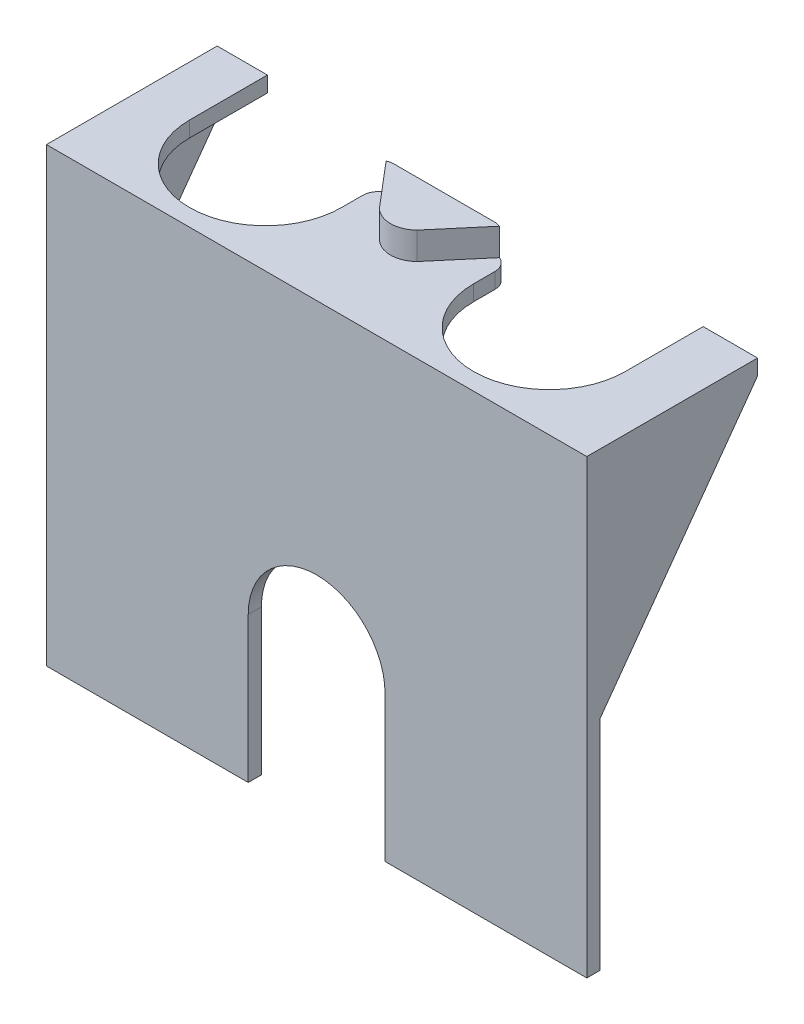
ISO-10303-21;
HEADER;
FILE_DESCRIPTION(('STEP AP214'),'2;1');
FILE_NAME('part.step','',(''),(''),'','','');
FILE_SCHEMA(('AUTOMOTIVE_DESIGN { 1 0 10303 214 1 1 1 1 }'));
ENDSEC;
DATA;
#1=APPLICATION_CONTEXT('core data for automotive mechanical design processes');
#2=APPLICATION_PROTOCOL_DEFINITION('international standard','automotive_design',2000,#1);
#3=PRODUCT_CONTEXT('',#1,'mechanical');
#4=PRODUCT('Part','Part','',(#3));
#5=PRODUCT_RELATED_PRODUCT_CATEGORY('part','',(#4));
#6=PRODUCT_DEFINITION_FORMATION('','',#4);
#7=PRODUCT_DEFINITION_CONTEXT('part definition',#1,'design');
#8=PRODUCT_DEFINITION('design','',#6,#7);
#9=PRODUCT_DEFINITION_SHAPE('','',#8);
#10=(LENGTH_UNIT() NAMED_UNIT(*) SI_UNIT(.MILLI.,.METRE.));
#11=(NAMED_UNIT(*) PLANE_ANGLE_UNIT() SI_UNIT($,.RADIAN.));
#12=(NAMED_UNIT(*) SI_UNIT($,.STERADIAN.) SOLID_ANGLE_UNIT());
#13=UNCERTAINTY_MEASURE_WITH_UNIT(LENGTH_MEASURE(1.E-05),#10,'distance_accuracy_value','');
#14=(GEOMETRIC_REPRESENTATION_CONTEXT(3) GLOBAL_UNCERTAINTY_ASSIGNED_CONTEXT((#13)) GLOBAL_UNIT_ASSIGNED_CONTEXT((#10,
#11,#12)) REPRESENTATION_CONTEXT('',''));
#15=CARTESIAN_POINT('',(0.,0.,0.));
#16=DIRECTION('',(0.,0.,1.));
#17=DIRECTION('',(1.,0.,0.));
#18=AXIS2_PLACEMENT_3D('',#15,#16,#17);
#19=CARTESIAN_POINT('',(0.,0.,0.));
#20=DIRECTION('',(0.,-1.,0.));
#21=DIRECTION('',(0.,0.,-1.));
#22=AXIS2_PLACEMENT_3D('',#19,#20,#21);
#23=PLANE('',#22);
#24=DIRECTION('',(1.,0.,0.));
#25=VECTOR('',#24,1.);
#26=CARTESIAN_POINT('',(0.,0.,-5.70068802749037));
#27=LINE('',#26,#25);
#28=CARTESIAN_POINT('',(72.,0.,-5.70068802749037));
#29=VERTEX_POINT('',#28);
#30=CARTESIAN_POINT('',(133.81659653948,0.,-5.70068802749037));
#31=VERTEX_POINT('',#30);
#32=EDGE_CURVE('E309',#29,#31,#27,.T.);
#33=ORIENTED_EDGE('',*,*,#32,.F.);
#34=DIRECTION('',(0.,0.,1.));
#35=VECTOR('',#34,1.);
#36=CARTESIAN_POINT('',(72.,0.,-5.70068802749037));
#37=LINE('',#36,#35);
#38=CARTESIAN_POINT('',(72.,0.,-35.6499148873949));
#39=VERTEX_POINT('',#38);
#40=EDGE_CURVE('E56',#39,#29,#37,.T.);
#41=ORIENTED_EDGE('',*,*,#40,.F.);
#42=DIRECTION('',(-1.,0.,0.));
#43=VECTOR('',#42,1.);
#44=CARTESIAN_POINT('',(0.,0.,-35.6499148873949));
#45=LINE('',#44,#43);
#46=CARTESIAN_POINT('',(81.8377847097465,0.,-35.6499148873949));
#47=VERTEX_POINT('',#46);
#48=EDGE_CURVE('E338',#47,#39,#45,.T.);
#49=ORIENTED_EDGE('',*,*,#48,.F.);
#50=CARTESIAN_POINT('',(81.8377847097465,0.,-31.6499148873949));
#51=DIRECTION('',(0.,-1.,0.));
#52=DIRECTION('',(0.,0.,-1.));
#53=AXIS2_PLACEMENT_3D('',#50,#51,#52);
#54=CIRCLE('',#53,4.);
#55=CARTESIAN_POINT('',(85.8377847097465,0.,-31.6499148873949));
#56=VERTEX_POINT('',#55);
#57=EDGE_CURVE('E449',#47,#56,#54,.T.);
#58=ORIENTED_EDGE('',*,*,#57,.T.);
#59=DIRECTION('',(0.,0.,1.));
#60=VECTOR('',#59,1.);
#61=CARTESIAN_POINT('',(85.8377847097465,0.,-26.185261769423));
#62=LINE('',#61,#60);
#63=CARTESIAN_POINT('',(85.8377847097465,0.,-26.185261769423));
#64=VERTEX_POINT('',#63);
#65=EDGE_CURVE('E384',#56,#64,#62,.T.);
#66=ORIENTED_EDGE('',*,*,#65,.T.);
#67=CARTESIAN_POINT('',(105.337784709747,0.,-26.185261769423));
#68=DIRECTION('',(0.,1.,0.));
#69=DIRECTION('',(0.,0.,1.));
#70=AXIS2_PLACEMENT_3D('',#67,#68,#69);
#71=CIRCLE('',#70,19.5);
#72=CARTESIAN_POINT('',(124.837784709747,0.,-26.185261769423));
#73=VERTEX_POINT('',#72);
#74=EDGE_CURVE('E411',#64,#73,#71,.T.);
#75=ORIENTED_EDGE('',*,*,#74,.T.);
#76=DIRECTION('',(0.,0.,-1.));
#77=VECTOR('',#76,1.);
#78=CARTESIAN_POINT('',(124.837784709747,0.,-51.7041526241251));
#79=LINE('',#78,#77);
#80=CARTESIAN_POINT('',(124.837784709747,0.,-46.1763892110471));
#81=VERTEX_POINT('',#80);
#82=EDGE_CURVE('E381',#73,#81,#79,.T.);
#83=ORIENTED_EDGE('',*,*,#82,.T.);
#84=DIRECTION('',(1.,0.,0.));
#85=VECTOR('',#84,1.);
#86=CARTESIAN_POINT('',(138.81659653948,0.,-46.1763892110471));
#87=LINE('',#86,#85);
#88=CARTESIAN_POINT('',(133.81659653948,0.,-46.1763892110471));
#89=VERTEX_POINT('',#88);
#90=EDGE_CURVE('E367',#81,#89,#87,.T.);
#91=ORIENTED_EDGE('',*,*,#90,.T.);
#92=DIRECTION('',(0.,0.,1.));
#93=VECTOR('',#92,1.);
#94=CARTESIAN_POINT('',(133.81659653948,0.,-5.70068802749037));
#95=LINE('',#94,#93);
#96=EDGE_CURVE('E265',#89,#31,#95,.T.);
#97=ORIENTED_EDGE('',*,*,#96,.T.);
#98=EDGE_LOOP('',(#33,#41,#49,#58,#66,#75,#83,#91,#97));
#99=FACE_BOUND('',#98,.T.);
#100=ADVANCED_FACE('F33',(#99),#23,.T.);
#101=CARTESIAN_POINT('',(0.,-112.,0.));
#102=DIRECTION('',(0.,-1.,0.));
#103=DIRECTION('',(0.,0.,-1.));
#104=AXIS2_PLACEMENT_3D('',#101,#102,#103);
#105=PLANE('',#104);
#106=DIRECTION('',(0.,0.,-1.));
#107=VECTOR('',#106,1.);
#108=CARTESIAN_POINT('',(51.8338642474497,-112.,0.));
#109=LINE('',#108,#107);
#110=CARTESIAN_POINT('',(51.8338642474497,-112.,-2.31963443005848));
#111=VERTEX_POINT('',#110);
#112=CARTESIAN_POINT('',(51.8338642474497,-112.,-5.70068802749037));
#113=VERTEX_POINT('',#112);
#114=EDGE_CURVE('E11',#111,#113,#109,.T.);
#115=ORIENTED_EDGE('',*,*,#114,.F.);
#116=DIRECTION('',(-1.,0.,0.));
#117=VECTOR('',#116,1.);
#118=CARTESIAN_POINT('',(0.,-112.,-2.31963443005848));
#119=LINE('',#118,#117);
#120=CARTESIAN_POINT('',(0.,-112.,-2.31963443005848));
#121=VERTEX_POINT('',#120);
#122=EDGE_CURVE('E321',#111,#121,#119,.T.);
#123=ORIENTED_EDGE('',*,*,#122,.T.);
#124=DIRECTION('',(0.,0.,-1.));
#125=VECTOR('',#124,1.);
#126=CARTESIAN_POINT('',(0.,-112.,-2.31963443005848));
#127=LINE('',#126,#125);
#128=CARTESIAN_POINT('',(0.,-112.,-5.70068802749037));
#129=VERTEX_POINT('',#128);
#130=EDGE_CURVE('E310',#121,#129,#127,.T.);
#131=ORIENTED_EDGE('',*,*,#130,.T.);
#132=DIRECTION('',(1.,0.,0.));
#133=VECTOR('',#132,1.);
#134=CARTESIAN_POINT('',(0.,-112.,-5.70068802749037));
#135=LINE('',#134,#133);
#136=EDGE_CURVE('E315',#129,#113,#135,.T.);
#137=ORIENTED_EDGE('',*,*,#136,.T.);
#138=EDGE_LOOP('',(#115,#123,#131,#137));
#139=FACE_BOUND('',#138,.T.);
#140=ADVANCED_FACE('F489',(#139),#105,.T.);
#141=CARTESIAN_POINT('',(0.,4.,0.));
#142=DIRECTION('',(0.,-1.,0.));
#143=DIRECTION('',(0.,0.,-1.));
#144=AXIS2_PLACEMENT_3D('',#141,#142,#143);
#145=PLANE('',#144);
#146=DIRECTION('',(0.,0.,1.));
#147=VECTOR('',#146,1.);
#148=CARTESIAN_POINT('',(0.,4.,0.));
#149=LINE('',#148,#147);
#150=CARTESIAN_POINT('',(0.,4.,-46.1763892110471));
#151=VERTEX_POINT('',#150);
#152=CARTESIAN_POINT('',(0.,4.,-2.31963443005848));
#153=VERTEX_POINT('',#152);
#154=EDGE_CURVE('E420',#151,#153,#149,.T.);
#155=ORIENTED_EDGE('',*,*,#154,.T.);
#156=DIRECTION('',(-1.,0.,0.));
#157=VECTOR('',#156,1.);
#158=CARTESIAN_POINT('',(-8.55709875259414,4.,-2.31963443005848));
#159=LINE('',#158,#157);
#160=CARTESIAN_POINT('',(138.81659653948,4.,-2.31963443005848));
#161=VERTEX_POINT('',#160);
#162=EDGE_CURVE('E331',#161,#153,#159,.T.);
#163=ORIENTED_EDGE('',*,*,#162,.F.);
#164=DIRECTION('',(0.,0.,-1.));
#165=VECTOR('',#164,1.);
#166=CARTESIAN_POINT('',(138.81659653948,4.,0.));
#167=LINE('',#166,#165);
#168=CARTESIAN_POINT('',(138.81659653948,4.,-46.1763892110471));
#169=VERTEX_POINT('',#168);
#170=EDGE_CURVE('E425',#161,#169,#167,.T.);
#171=ORIENTED_EDGE('',*,*,#170,.T.);
#172=DIRECTION('',(1.,0.,0.));
#173=VECTOR('',#172,1.);
#174=CARTESIAN_POINT('',(138.81659653948,4.,-46.1763892110471));
#175=LINE('',#174,#173);
#176=CARTESIAN_POINT('',(124.837784709747,4.,-46.1763892110471));
#177=VERTEX_POINT('',#176);
#178=EDGE_CURVE('E361',#177,#169,#175,.T.);
#179=ORIENTED_EDGE('',*,*,#178,.F.);
#180=DIRECTION('',(0.,0.,-1.));
#181=VECTOR('',#180,1.);
#182=CARTESIAN_POINT('',(124.837784709747,4.,-51.7041526241251));
#183=LINE('',#182,#181);
#184=CARTESIAN_POINT('',(124.837784709747,4.,-26.185261769423));
#185=VERTEX_POINT('',#184);
#186=EDGE_CURVE('E380',#185,#177,#183,.T.);
#187=ORIENTED_EDGE('',*,*,#186,.F.);
#188=CARTESIAN_POINT('',(105.337784709747,4.,-26.185261769423));
#189=DIRECTION('',(0.,1.,0.));
#190=DIRECTION('',(0.,0.,1.));
#191=AXIS2_PLACEMENT_3D('',#188,#189,#190);
#192=CIRCLE('',#191,19.5);
#193=CARTESIAN_POINT('',(85.8377847097465,4.,-26.185261769423));
#194=VERTEX_POINT('',#193);
#195=EDGE_CURVE('E409',#194,#185,#192,.T.);
#196=ORIENTED_EDGE('',*,*,#195,.F.);
#197=DIRECTION('',(0.,0.,1.));
#198=VECTOR('',#197,1.);
#199=CARTESIAN_POINT('',(85.8377847097465,4.,-26.185261769423));
#200=LINE('',#199,#198);
#201=CARTESIAN_POINT('',(85.8377847097465,4.,-31.6499148873949));
#202=VERTEX_POINT('',#201);
#203=EDGE_CURVE('E385',#202,#194,#200,.T.);
#204=ORIENTED_EDGE('',*,*,#203,.F.);
#205=CARTESIAN_POINT('',(81.8377847097465,4.,-31.6499148873949));
#206=DIRECTION('',(0.,-1.,0.));
#207=DIRECTION('',(0.,0.,-1.));
#208=AXIS2_PLACEMENT_3D('',#205,#206,#207);
#209=CIRCLE('',#208,4.);
#210=CARTESIAN_POINT('',(83.347666464026,4.,-35.3540014263534));
#211=VERTEX_POINT('',#210);
#212=EDGE_CURVE('E435',#202,#211,#209,.F.);
#213=ORIENTED_EDGE('',*,*,#212,.T.);
#214=DIRECTION('',(0.646981841068782,0.,-0.762505408064264));
#215=VECTOR('',#214,1.);
#216=CARTESIAN_POINT('',(84.2966893711323,4.,-36.4724796480142));
#217=LINE('',#216,#215);
#218=CARTESIAN_POINT('',(73.6211001469707,4.,-23.8906821368992));
#219=VERTEX_POINT('',#218);
#220=EDGE_CURVE('E344',#219,#211,#217,.T.);
#221=ORIENTED_EDGE('',*,*,#220,.F.);
#222=CARTESIAN_POINT('',(68.8011265178912,4.,-28.8002457231346));
#223=DIRECTION('',(0.,1.,0.));
#224=DIRECTION('',(0.,0.,1.));
#225=AXIS2_PLACEMENT_3D('',#222,#223,#224);
#226=CIRCLE('',#225,6.88011339966942);
#227=CARTESIAN_POINT('',(63.8915629316558,4.,-23.980272094055));
#228=VERTEX_POINT('',#227);
#229=EDGE_CURVE('E351',#228,#219,#226,.T.);
#230=ORIENTED_EDGE('',*,*,#229,.F.);
#231=DIRECTION('',(0.647758370321477,0.,0.761845846401005));
#232=VECTOR('',#231,1.);
#233=CARTESIAN_POINT('',(63.8915629316558,4.,-23.980272094055));
#234=LINE('',#233,#232);
#235=CARTESIAN_POINT('',(54.2685316133008,4.,-35.2981751510809));
#236=VERTEX_POINT('',#235);
#237=EDGE_CURVE('E340',#236,#228,#234,.T.);
#238=ORIENTED_EDGE('',*,*,#237,.F.);
#239=CARTESIAN_POINT('',(55.9087136301543,4.,-31.6499148873949));
#240=DIRECTION('',(0.,-1.,0.));
#241=DIRECTION('',(0.,0.,-1.));
#242=AXIS2_PLACEMENT_3D('',#239,#240,#241);
#243=CIRCLE('',#242,4.);
#244=CARTESIAN_POINT('',(51.9087136301543,4.,-31.6499148873949));
#245=VERTEX_POINT('',#244);
#246=EDGE_CURVE('E433',#236,#245,#243,.F.);
#247=ORIENTED_EDGE('',*,*,#246,.T.);
#248=DIRECTION('',(0.,0.,-1.));
#249=VECTOR('',#248,1.);
#250=CARTESIAN_POINT('',(51.9087136301543,4.,-51.7041526241251));
#251=LINE('',#250,#249);
#252=CARTESIAN_POINT('',(51.9087136301543,4.,-26.185261769423));
#253=VERTEX_POINT('',#252);
#254=EDGE_CURVE('E394',#253,#245,#251,.T.);
#255=ORIENTED_EDGE('',*,*,#254,.F.);
#256=CARTESIAN_POINT('',(32.4087136301543,4.,-26.185261769423));
#257=DIRECTION('',(0.,1.,0.));
#258=DIRECTION('',(0.,0.,1.));
#259=AXIS2_PLACEMENT_3D('',#256,#257,#258);
#260=CIRCLE('',#259,19.5);
#261=CARTESIAN_POINT('',(12.9087136301543,4.,-26.185261769423));
#262=VERTEX_POINT('',#261);
#263=EDGE_CURVE('E414',#262,#253,#260,.T.);
#264=ORIENTED_EDGE('',*,*,#263,.F.);
#265=DIRECTION('',(0.,0.,1.));
#266=VECTOR('',#265,1.);
#267=CARTESIAN_POINT('',(12.9087136301543,4.,-26.185261769423));
#268=LINE('',#267,#266);
#269=CARTESIAN_POINT('',(12.9087136301543,4.,-46.1763892110471));
#270=VERTEX_POINT('',#269);
#271=EDGE_CURVE('E400',#270,#262,#268,.T.);
#272=ORIENTED_EDGE('',*,*,#271,.F.);
#273=EDGE_CURVE('E368',#151,#270,#175,.T.);
#274=ORIENTED_EDGE('',*,*,#273,.F.);
#275=EDGE_LOOP('',(#155,#163,#171,#179,#187,#196,#204,#213,#221,#230,#238,#247,#255,#264,#272,#274));
#276=FACE_BOUND('',#275,.T.);
#277=ADVANCED_FACE('F475',(#276),#145,.F.);
#278=CARTESIAN_POINT('',(105.337784709747,0.,-26.185261769423));
#279=DIRECTION('',(0.,1.,0.));
#280=DIRECTION('',(0.,0.,1.));
#281=AXIS2_PLACEMENT_3D('',#278,#279,#280);
#282=CYLINDRICAL_SURFACE('',#281,19.5);
#283=DIRECTION('',(0.,1.,0.));
#284=VECTOR('',#283,1.);
#285=CARTESIAN_POINT('',(85.8377847097465,0.,-26.185261769423));
#286=LINE('',#285,#284);
#287=EDGE_CURVE('E391',#64,#194,#286,.T.);
#288=ORIENTED_EDGE('',*,*,#287,.T.);
#289=ORIENTED_EDGE('',*,*,#195,.T.);
#290=DIRECTION('',(0.,1.,0.));
#291=VECTOR('',#290,1.);
#292=CARTESIAN_POINT('',(124.837784709747,0.,-26.185261769423));
#293=LINE('',#292,#291);
#294=EDGE_CURVE('E387',#73,#185,#293,.T.);
#295=ORIENTED_EDGE('',*,*,#294,.F.);
#296=ORIENTED_EDGE('',*,*,#74,.F.);
#297=EDGE_LOOP('',(#288,#289,#295,#296));
#298=FACE_BOUND('',#297,.T.);
#299=ADVANCED_FACE('F782',(#298),#282,.F.);
#300=CARTESIAN_POINT('',(32.4087136301543,0.,-26.185261769423));
#301=DIRECTION('',(0.,1.,0.));
#302=DIRECTION('',(0.,0.,1.));
#303=AXIS2_PLACEMENT_3D('',#300,#301,#302);
#304=CYLINDRICAL_SURFACE('',#303,19.5);
#305=DIRECTION('',(0.,1.,0.));
#306=VECTOR('',#305,1.);
#307=CARTESIAN_POINT('',(12.9087136301543,0.,-26.185261769423));
#308=LINE('',#307,#306);
#309=CARTESIAN_POINT('',(12.9087136301543,0.,-26.185261769423));
#310=VERTEX_POINT('',#309);
#311=EDGE_CURVE('E406',#310,#262,#308,.T.);
#312=ORIENTED_EDGE('',*,*,#311,.T.);
#313=ORIENTED_EDGE('',*,*,#263,.T.);
#314=DIRECTION('',(0.,1.,0.));
#315=VECTOR('',#314,1.);
#316=CARTESIAN_POINT('',(51.9087136301543,0.,-26.185261769423));
#317=LINE('',#316,#315);
#318=CARTESIAN_POINT('',(51.9087136301543,0.,-26.185261769423));
#319=VERTEX_POINT('',#318);
#320=EDGE_CURVE('E402',#319,#253,#317,.T.);
#321=ORIENTED_EDGE('',*,*,#320,.F.);
#322=CARTESIAN_POINT('',(32.4087136301543,0.,-26.185261769423));
#323=DIRECTION('',(0.,1.,0.));
#324=DIRECTION('',(0.,0.,1.));
#325=AXIS2_PLACEMENT_3D('',#322,#323,#324);
#326=CIRCLE('',#325,19.5);
#327=EDGE_CURVE('E417',#310,#319,#326,.T.);
#328=ORIENTED_EDGE('',*,*,#327,.F.);
#329=EDGE_LOOP('',(#312,#313,#321,#328));
#330=FACE_BOUND('',#329,.T.);
#331=ADVANCED_FACE('F653',(#330),#304,.F.);
#332=CARTESIAN_POINT('',(0.,4.,0.));
#333=DIRECTION('',(1.,0.,0.));
#334=DIRECTION('',(0.,0.,-1.));
#335=AXIS2_PLACEMENT_3D('',#332,#333,#334);
#336=PLANE('',#335);
#337=DIRECTION('',(0.,1.,0.));
#338=VECTOR('',#337,1.);
#339=CARTESIAN_POINT('',(0.,0.,-46.1763892110471));
#340=LINE('',#339,#338);
#341=CARTESIAN_POINT('',(0.,0.,-46.1763892110471));
#342=VERTEX_POINT('',#341);
#343=EDGE_CURVE('E365',#342,#151,#340,.T.);
#344=ORIENTED_EDGE('',*,*,#343,.F.);
#345=DIRECTION('',(0.,-0.810464460781244,0.585787809544179));
#346=VECTOR('',#345,1.);
#347=CARTESIAN_POINT('',(0.,-56.,-5.70068802749037));
#348=LINE('',#347,#346);
#349=CARTESIAN_POINT('',(0.,-56.,-5.70068802749037));
#350=VERTEX_POINT('',#349);
#351=EDGE_CURVE('E273',#342,#350,#348,.T.);
#352=ORIENTED_EDGE('',*,*,#351,.T.);
#353=DIRECTION('',(0.,1.,0.));
#354=VECTOR('',#353,1.);
#355=CARTESIAN_POINT('',(0.,-112.,-5.70068802749037));
#356=LINE('',#355,#354);
#357=EDGE_CURVE('E329',#129,#350,#356,.T.);
#358=ORIENTED_EDGE('',*,*,#357,.F.);
#359=ORIENTED_EDGE('',*,*,#130,.F.);
#360=DIRECTION('',(0.,1.,0.));
#361=VECTOR('',#360,1.);
#362=CARTESIAN_POINT('',(0.,4.,-2.31963443005848));
#363=LINE('',#362,#361);
#364=EDGE_CURVE('E335',#121,#153,#363,.T.);
#365=ORIENTED_EDGE('',*,*,#364,.T.);
#366=ORIENTED_EDGE('',*,*,#154,.F.);
#367=EDGE_LOOP('',(#344,#352,#358,#359,#365,#366));
#368=FACE_BOUND('',#367,.T.);
#369=ADVANCED_FACE('F483',(#368),#336,.F.);
#370=CARTESIAN_POINT('',(138.81659653948,4.,0.));
#371=DIRECTION('',(-1.,0.,0.));
#372=DIRECTION('',(0.,0.,1.));
#373=AXIS2_PLACEMENT_3D('',#370,#371,#372);
#374=PLANE('',#373);
#375=DIRECTION('',(0.,0.810464460781244,-0.585787809544179));
#376=VECTOR('',#375,1.);
#377=CARTESIAN_POINT('',(138.81659653948,0.,-46.1763892110471));
#378=LINE('',#377,#376);
#379=CARTESIAN_POINT('',(138.81659653948,-56.,-5.70068802749037));
#380=VERTEX_POINT('',#379);
#381=CARTESIAN_POINT('',(138.81659653948,0.,-46.1763892110471));
#382=VERTEX_POINT('',#381);
#383=EDGE_CURVE('E258',#380,#382,#378,.T.);
#384=ORIENTED_EDGE('',*,*,#383,.T.);
#385=DIRECTION('',(0.,1.,0.));
#386=VECTOR('',#385,1.);
#387=CARTESIAN_POINT('',(138.81659653948,0.,-46.1763892110471));
#388=LINE('',#387,#386);
#389=EDGE_CURVE('E370',#382,#169,#388,.T.);
#390=ORIENTED_EDGE('',*,*,#389,.T.);
#391=ORIENTED_EDGE('',*,*,#170,.F.);
#392=DIRECTION('',(0.,-1.,0.));
#393=VECTOR('',#392,1.);
#394=CARTESIAN_POINT('',(138.81659653948,4.,-2.31963443005848));
#395=LINE('',#394,#393);
#396=CARTESIAN_POINT('',(138.81659653948,-112.,-2.31963443005848));
#397=VERTEX_POINT('',#396);
#398=EDGE_CURVE('E333',#161,#397,#395,.T.);
#399=ORIENTED_EDGE('',*,*,#398,.T.);
#400=DIRECTION('',(0.,0.,1.));
#401=VECTOR('',#400,1.);
#402=CARTESIAN_POINT('',(138.81659653948,-112.,-2.31963443005848));
#403=LINE('',#402,#401);
#404=CARTESIAN_POINT('',(138.81659653948,-112.,-5.70068802749037));
#405=VERTEX_POINT('',#404);
#406=EDGE_CURVE('E318',#405,#397,#403,.T.);
#407=ORIENTED_EDGE('',*,*,#406,.F.);
#408=DIRECTION('',(0.,1.,0.));
#409=VECTOR('',#408,1.);
#410=CARTESIAN_POINT('',(138.81659653948,-112.,-5.70068802749037));
#411=LINE('',#410,#409);
#412=EDGE_CURVE('E325',#405,#380,#411,.T.);
#413=ORIENTED_EDGE('',*,*,#412,.T.);
#414=EDGE_LOOP('',(#384,#390,#391,#399,#407,#413));
#415=FACE_BOUND('',#414,.T.);
#416=ADVANCED_FACE('F470',(#415),#374,.F.);
#417=DIRECTION('',(0.,0.,1.));
#418=VECTOR('',#417,1.);
#419=CARTESIAN_POINT('',(66.,0.,-5.70068802749037));
#420=LINE('',#419,#418);
#421=CARTESIAN_POINT('',(66.,0.,-35.6499148873949));
#422=VERTEX_POINT('',#421);
#423=CARTESIAN_POINT('',(66.,0.,-5.70068802749037));
#424=VERTEX_POINT('',#423);
#425=EDGE_CURVE('E242',#422,#424,#420,.T.);
#426=ORIENTED_EDGE('',*,*,#425,.T.);
#427=CARTESIAN_POINT('',(5.,0.,-5.70068802749037));
#428=VERTEX_POINT('',#427);
#429=EDGE_CURVE('E314',#428,#424,#27,.T.);
#430=ORIENTED_EDGE('',*,*,#429,.F.);
#431=DIRECTION('',(0.,0.,-1.));
#432=VECTOR('',#431,1.);
#433=CARTESIAN_POINT('',(5.,0.,-46.1763892110471));
#434=LINE('',#433,#432);
#435=CARTESIAN_POINT('',(5.,0.,-46.1763892110471));
#436=VERTEX_POINT('',#435);
#437=EDGE_CURVE('E281',#428,#436,#434,.T.);
#438=ORIENTED_EDGE('',*,*,#437,.T.);
#439=CARTESIAN_POINT('',(12.9087136301543,0.,-46.1763892110471));
#440=VERTEX_POINT('',#439);
#441=EDGE_CURVE('E366',#436,#440,#87,.T.);
#442=ORIENTED_EDGE('',*,*,#441,.T.);
#443=DIRECTION('',(0.,0.,1.));
#444=VECTOR('',#443,1.);
#445=CARTESIAN_POINT('',(12.9087136301543,0.,-26.185261769423));
#446=LINE('',#445,#444);
#447=EDGE_CURVE('E399',#440,#310,#446,.T.);
#448=ORIENTED_EDGE('',*,*,#447,.T.);
#449=ORIENTED_EDGE('',*,*,#327,.T.);
#450=DIRECTION('',(0.,0.,-1.));
#451=VECTOR('',#450,1.);
#452=CARTESIAN_POINT('',(51.9087136301543,0.,-51.7041526241251));
#453=LINE('',#452,#451);
#454=CARTESIAN_POINT('',(51.9087136301543,0.,-31.6499148873949));
#455=VERTEX_POINT('',#454);
#456=EDGE_CURVE('E396',#319,#455,#453,.T.);
#457=ORIENTED_EDGE('',*,*,#456,.T.);
#458=CARTESIAN_POINT('',(55.9087136301543,0.,-31.6499148873949));
#459=DIRECTION('',(0.,-1.,0.));
#460=DIRECTION('',(0.,0.,-1.));
#461=AXIS2_PLACEMENT_3D('',#458,#459,#460);
#462=CIRCLE('',#461,4.);
#463=CARTESIAN_POINT('',(55.9087136301543,0.,-35.6499148873949));
#464=VERTEX_POINT('',#463);
#465=EDGE_CURVE('E447',#455,#464,#462,.T.);
#466=ORIENTED_EDGE('',*,*,#465,.T.);
#467=EDGE_CURVE('E48',#422,#464,#45,.T.);
#468=ORIENTED_EDGE('',*,*,#467,.F.);
#469=EDGE_LOOP('',(#426,#430,#438,#442,#448,#449,#457,#466,#468));
#470=FACE_BOUND('',#469,.T.);
#471=ADVANCED_FACE('F508',(#470),#23,.T.);
#472=CARTESIAN_POINT('',(51.9087136301543,0.,-51.7041526241251));
#473=DIRECTION('',(1.,0.,0.));
#474=DIRECTION('',(0.,0.,-1.));
#475=AXIS2_PLACEMENT_3D('',#472,#473,#474);
#476=PLANE('',#475);
#477=ORIENTED_EDGE('',*,*,#254,.T.);
#478=DIRECTION('',(0.,-1.,0.));
#479=VECTOR('',#478,1.);
#480=CARTESIAN_POINT('',(51.9087136301543,0.,-31.6499148873949));
#481=LINE('',#480,#479);
#482=EDGE_CURVE('E451',#245,#455,#481,.T.);
#483=ORIENTED_EDGE('',*,*,#482,.T.);
#484=ORIENTED_EDGE('',*,*,#456,.F.);
#485=ORIENTED_EDGE('',*,*,#320,.T.);
#486=EDGE_LOOP('',(#477,#483,#484,#485));
#487=FACE_BOUND('',#486,.T.);
#488=ADVANCED_FACE('F515',(#487),#476,.F.);
#489=CARTESIAN_POINT('',(12.9087136301543,0.,-26.185261769423));
#490=DIRECTION('',(-1.,0.,0.));
#491=DIRECTION('',(0.,0.,1.));
#492=AXIS2_PLACEMENT_3D('',#489,#490,#491);
#493=PLANE('',#492);
#494=ORIENTED_EDGE('',*,*,#447,.F.);
#495=DIRECTION('',(0.,1.,0.));
#496=VECTOR('',#495,1.);
#497=CARTESIAN_POINT('',(12.9087136301543,0.,-46.1763892110471));
#498=LINE('',#497,#496);
#499=EDGE_CURVE('E377',#440,#270,#498,.T.);
#500=ORIENTED_EDGE('',*,*,#499,.T.);
#501=ORIENTED_EDGE('',*,*,#271,.T.);
#502=ORIENTED_EDGE('',*,*,#311,.F.);
#503=EDGE_LOOP('',(#494,#500,#501,#502));
#504=FACE_BOUND('',#503,.T.);
#505=ADVANCED_FACE('F520',(#504),#493,.F.);
#506=CARTESIAN_POINT('',(124.837784709747,0.,-51.7041526241251));
#507=DIRECTION('',(1.,0.,0.));
#508=DIRECTION('',(0.,0.,-1.));
#509=AXIS2_PLACEMENT_3D('',#506,#507,#508);
#510=PLANE('',#509);
#511=ORIENTED_EDGE('',*,*,#186,.T.);
#512=DIRECTION('',(0.,-1.,0.));
#513=VECTOR('',#512,1.);
#514=CARTESIAN_POINT('',(124.837784709747,0.,-46.1763892110471));
#515=LINE('',#514,#513);
#516=EDGE_CURVE('E373',#177,#81,#515,.T.);
#517=ORIENTED_EDGE('',*,*,#516,.T.);
#518=ORIENTED_EDGE('',*,*,#82,.F.);
#519=ORIENTED_EDGE('',*,*,#294,.T.);
#520=EDGE_LOOP('',(#511,#517,#518,#519));
#521=FACE_BOUND('',#520,.T.);
#522=ADVANCED_FACE('F739',(#521),#510,.F.);
#523=CARTESIAN_POINT('',(85.8377847097465,0.,-26.185261769423));
#524=DIRECTION('',(-1.,0.,0.));
#525=DIRECTION('',(0.,0.,1.));
#526=AXIS2_PLACEMENT_3D('',#523,#524,#525);
#527=PLANE('',#526);
#528=ORIENTED_EDGE('',*,*,#65,.F.);
#529=DIRECTION('',(0.,1.,0.));
#530=VECTOR('',#529,1.);
#531=CARTESIAN_POINT('',(85.8377847097465,0.,-31.6499148873949));
#532=LINE('',#531,#530);
#533=EDGE_CURVE('E430',#56,#202,#532,.T.);
#534=ORIENTED_EDGE('',*,*,#533,.T.);
#535=ORIENTED_EDGE('',*,*,#203,.T.);
#536=ORIENTED_EDGE('',*,*,#287,.F.);
#537=EDGE_LOOP('',(#528,#534,#535,#536));
#538=FACE_BOUND('',#537,.T.);
#539=ADVANCED_FACE('F733',(#538),#527,.F.);
#540=CARTESIAN_POINT('',(138.81659653948,0.,-46.1763892110471));
#541=DIRECTION('',(0.,0.,1.));
#542=DIRECTION('',(1.,0.,0.));
#543=AXIS2_PLACEMENT_3D('',#540,#541,#542);
#544=PLANE('',#543);
#545=ORIENTED_EDGE('',*,*,#178,.T.);
#546=ORIENTED_EDGE('',*,*,#389,.F.);
#547=DIRECTION('',(1.,0.,0.));
#548=VECTOR('',#547,1.);
#549=CARTESIAN_POINT('',(133.81659653948,0.,-46.1763892110471));
#550=LINE('',#549,#548);
#551=EDGE_CURVE('E271',#89,#382,#550,.T.);
#552=ORIENTED_EDGE('',*,*,#551,.F.);
#553=ORIENTED_EDGE('',*,*,#90,.F.);
#554=ORIENTED_EDGE('',*,*,#516,.F.);
#555=EDGE_LOOP('',(#545,#546,#552,#553,#554));
#556=FACE_BOUND('',#555,.T.);
#557=ADVANCED_FACE('F738',(#556),#544,.F.);
#558=EDGE_CURVE('E362',#342,#436,#87,.T.);
#559=ORIENTED_EDGE('',*,*,#558,.F.);
#560=ORIENTED_EDGE('',*,*,#343,.T.);
#561=ORIENTED_EDGE('',*,*,#273,.T.);
#562=ORIENTED_EDGE('',*,*,#499,.F.);
#563=ORIENTED_EDGE('',*,*,#441,.F.);
#564=EDGE_LOOP('',(#559,#560,#561,#562,#563));
#565=FACE_BOUND('',#564,.T.);
#566=ADVANCED_FACE('F725',(#565),#544,.F.);
#567=CARTESIAN_POINT('',(63.8915629316558,11.,-23.980272094055));
#568=DIRECTION('',(0.761845846401005,0.,-0.647758370321477));
#569=DIRECTION('',(-0.647758370321477,0.,-0.761845846401005));
#570=AXIS2_PLACEMENT_3D('',#567,#568,#569);
#571=PLANE('',#570);
#572=DIRECTION('',(0.647758370321477,0.,0.761845846401005));
#573=VECTOR('',#572,1.);
#574=CARTESIAN_POINT('',(63.8915629316558,11.,-23.980272094055));
#575=LINE('',#574,#573);
#576=CARTESIAN_POINT('',(54.2685316133008,11.,-35.2981751510809));
#577=VERTEX_POINT('',#576);
#578=CARTESIAN_POINT('',(63.8915629316558,11.,-23.980272094055));
#579=VERTEX_POINT('',#578);
#580=EDGE_CURVE('E341',#577,#579,#575,.T.);
#581=ORIENTED_EDGE('',*,*,#580,.F.);
#582=DIRECTION('',(0.,-1.,0.));
#583=VECTOR('',#582,1.);
#584=CARTESIAN_POINT('',(54.2685316133008,11.,-35.2981751510809));
#585=LINE('',#584,#583);
#586=EDGE_CURVE('E454',#577,#236,#585,.T.);
#587=ORIENTED_EDGE('',*,*,#586,.T.);
#588=ORIENTED_EDGE('',*,*,#237,.T.);
#589=DIRECTION('',(0.,-1.,0.));
#590=VECTOR('',#589,1.);
#591=CARTESIAN_POINT('',(63.8915629316558,11.,-23.980272094055));
#592=LINE('',#591,#590);
#593=EDGE_CURVE('E358',#579,#228,#592,.T.);
#594=ORIENTED_EDGE('',*,*,#593,.F.);
#595=EDGE_LOOP('',(#581,#587,#588,#594));
#596=FACE_BOUND('',#595,.T.);
#597=ADVANCED_FACE('F720',(#596),#571,.F.);
#598=CARTESIAN_POINT('',(68.8011265178912,11.,-28.8002457231346));
#599=DIRECTION('',(0.,-1.,0.));
#600=DIRECTION('',(0.,0.,-1.));
#601=AXIS2_PLACEMENT_3D('',#598,#599,#600);
#602=CYLINDRICAL_SURFACE('',#601,6.88011339966942);
#603=ORIENTED_EDGE('',*,*,#229,.T.);
#604=DIRECTION('',(0.,-1.,0.));
#605=VECTOR('',#604,1.);
#606=CARTESIAN_POINT('',(73.6211001469707,11.,-23.8906821368992));
#607=LINE('',#606,#605);
#608=CARTESIAN_POINT('',(73.6211001469707,11.,-23.8906821368992));
#609=VERTEX_POINT('',#608);
#610=EDGE_CURVE('E349',#609,#219,#607,.T.);
#611=ORIENTED_EDGE('',*,*,#610,.F.);
#612=CARTESIAN_POINT('',(68.8011265178912,11.,-28.8002457231346));
#613=DIRECTION('',(0.,1.,0.));
#614=DIRECTION('',(0.,0.,1.));
#615=AXIS2_PLACEMENT_3D('',#612,#613,#614);
#616=CIRCLE('',#615,6.88011339966942);
#617=EDGE_CURVE('E343',#579,#609,#616,.T.);
#618=ORIENTED_EDGE('',*,*,#617,.F.);
#619=ORIENTED_EDGE('',*,*,#593,.T.);
#620=EDGE_LOOP('',(#603,#611,#618,#619));
#621=FACE_BOUND('',#620,.T.);
#622=ADVANCED_FACE('F712',(#621),#602,.T.);
#623=CARTESIAN_POINT('',(84.2966893711323,11.,-36.4724796480142));
#624=DIRECTION('',(-0.762505408064264,0.,-0.646981841068781));
#625=DIRECTION('',(-0.646981841068781,0.,0.762505408064264));
#626=AXIS2_PLACEMENT_3D('',#623,#624,#625);
#627=PLANE('',#626);
#628=ORIENTED_EDGE('',*,*,#220,.T.);
#629=DIRECTION('',(0.,1.,0.));
#630=VECTOR('',#629,1.);
#631=CARTESIAN_POINT('',(83.347666464026,4.,-35.3540014263534));
#632=LINE('',#631,#630);
#633=CARTESIAN_POINT('',(83.347666464026,11.,-35.3540014263534));
#634=VERTEX_POINT('',#633);
#635=EDGE_CURVE('E437',#211,#634,#632,.T.);
#636=ORIENTED_EDGE('',*,*,#635,.T.);
#637=DIRECTION('',(0.646981841068782,0.,-0.762505408064264));
#638=VECTOR('',#637,1.);
#639=CARTESIAN_POINT('',(84.2966893711323,11.,-36.4724796480142));
#640=LINE('',#639,#638);
#641=EDGE_CURVE('E346',#609,#634,#640,.T.);
#642=ORIENTED_EDGE('',*,*,#641,.F.);
#643=ORIENTED_EDGE('',*,*,#610,.T.);
#644=EDGE_LOOP('',(#628,#636,#642,#643));
#645=FACE_BOUND('',#644,.T.);
#646=ADVANCED_FACE('F702',(#645),#627,.F.);
#647=CARTESIAN_POINT('',(68.8011265178912,11.,-28.8002457231346));
#648=DIRECTION('',(0.,1.,0.));
#649=DIRECTION('',(0.,0.,1.));
#650=AXIS2_PLACEMENT_3D('',#647,#648,#649);
#651=PLANE('',#650);
#652=ORIENTED_EDGE('',*,*,#641,.T.);
#653=CARTESIAN_POINT('',(81.8377847097465,11.,-31.6499148873949));
#654=DIRECTION('',(0.,1.,0.));
#655=DIRECTION('',(0.,0.,1.));
#656=AXIS2_PLACEMENT_3D('',#653,#654,#655);
#657=CIRCLE('',#656,4.);
#658=CARTESIAN_POINT('',(81.8377847097465,11.,-35.6499148873949));
#659=VERTEX_POINT('',#658);
#660=EDGE_CURVE('E441',#634,#659,#657,.T.);
#661=ORIENTED_EDGE('',*,*,#660,.T.);
#662=DIRECTION('',(1.,0.,0.));
#663=VECTOR('',#662,1.);
#664=CARTESIAN_POINT('',(68.8011265178912,11.,-35.6499148873949));
#665=LINE('',#664,#663);
#666=CARTESIAN_POINT('',(55.9087136301543,11.,-35.6499148873949));
#667=VERTEX_POINT('',#666);
#668=EDGE_CURVE('E427',#667,#659,#665,.T.);
#669=ORIENTED_EDGE('',*,*,#668,.F.);
#670=CARTESIAN_POINT('',(55.9087136301543,11.,-31.6499148873949));
#671=DIRECTION('',(0.,1.,0.));
#672=DIRECTION('',(0.,0.,1.));
#673=AXIS2_PLACEMENT_3D('',#670,#671,#672);
#674=CIRCLE('',#673,4.);
#675=EDGE_CURVE('E439',#667,#577,#674,.T.);
#676=ORIENTED_EDGE('',*,*,#675,.T.);
#677=ORIENTED_EDGE('',*,*,#580,.T.);
#678=ORIENTED_EDGE('',*,*,#617,.T.);
#679=EDGE_LOOP('',(#652,#661,#669,#676,#677,#678));
#680=FACE_BOUND('',#679,.T.);
#681=ADVANCED_FACE('F614',(#680),#651,.T.);
#682=CARTESIAN_POINT('',(0.,0.,-35.6499148873949));
#683=DIRECTION('',(0.,0.,1.));
#684=DIRECTION('',(1.,0.,0.));
#685=AXIS2_PLACEMENT_3D('',#682,#683,#684);
#686=PLANE('',#685);
#687=ORIENTED_EDGE('',*,*,#668,.T.);
#688=DIRECTION('',(0.,1.,0.));
#689=VECTOR('',#688,1.);
#690=CARTESIAN_POINT('',(81.8377847097465,0.,-35.6499148873949));
#691=LINE('',#690,#689);
#692=EDGE_CURVE('E445',#659,#47,#691,.F.);
#693=ORIENTED_EDGE('',*,*,#692,.T.);
#694=ORIENTED_EDGE('',*,*,#48,.T.);
#695=DIRECTION('',(1.,0.,0.));
#696=VECTOR('',#695,1.);
#697=CARTESIAN_POINT('',(66.,0.,-35.6499148873949));
#698=LINE('',#697,#696);
#699=EDGE_CURVE('E241',#422,#39,#698,.T.);
#700=ORIENTED_EDGE('',*,*,#699,.F.);
#701=ORIENTED_EDGE('',*,*,#467,.T.);
#702=DIRECTION('',(0.,-1.,0.));
#703=VECTOR('',#702,1.);
#704=CARTESIAN_POINT('',(55.9087136301543,0.,-35.6499148873949));
#705=LINE('',#704,#703);
#706=EDGE_CURVE('E443',#464,#667,#705,.F.);
#707=ORIENTED_EDGE('',*,*,#706,.T.);
#708=EDGE_LOOP('',(#687,#693,#694,#700,#701,#707));
#709=FACE_BOUND('',#708,.T.);
#710=ADVANCED_FACE('F609',(#709),#686,.F.);
#711=CARTESIAN_POINT('',(81.8377847097465,0.,-31.6499148873949));
#712=DIRECTION('',(0.,1.,0.));
#713=DIRECTION('',(0.,0.,1.));
#714=AXIS2_PLACEMENT_3D('',#711,#712,#713);
#715=CYLINDRICAL_SURFACE('',#714,4.);
#716=ORIENTED_EDGE('',*,*,#57,.F.);
#717=ORIENTED_EDGE('',*,*,#692,.F.);
#718=ORIENTED_EDGE('',*,*,#660,.F.);
#719=ORIENTED_EDGE('',*,*,#635,.F.);
#720=ORIENTED_EDGE('',*,*,#212,.F.);
#721=ORIENTED_EDGE('',*,*,#533,.F.);
#722=EDGE_LOOP('',(#716,#717,#718,#719,#720,#721));
#723=FACE_BOUND('',#722,.T.);
#724=ADVANCED_FACE('F613',(#723),#715,.T.);
#725=CARTESIAN_POINT('',(55.9087136301543,0.,-31.6499148873949));
#726=DIRECTION('',(0.,-1.,0.));
#727=DIRECTION('',(0.,0.,-1.));
#728=AXIS2_PLACEMENT_3D('',#725,#726,#727);
#729=CYLINDRICAL_SURFACE('',#728,4.);
#730=ORIENTED_EDGE('',*,*,#675,.F.);
#731=ORIENTED_EDGE('',*,*,#706,.F.);
#732=ORIENTED_EDGE('',*,*,#465,.F.);
#733=ORIENTED_EDGE('',*,*,#482,.F.);
#734=ORIENTED_EDGE('',*,*,#246,.F.);
#735=ORIENTED_EDGE('',*,*,#586,.F.);
#736=EDGE_LOOP('',(#730,#731,#732,#733,#734,#735));
#737=FACE_BOUND('',#736,.T.);
#738=ADVANCED_FACE('F35',(#737),#729,.T.);
#739=CARTESIAN_POINT('',(-8.55709875259414,-9.,-2.31963443005848));
#740=DIRECTION('',(0.,0.,-1.));
#741=DIRECTION('',(-1.,0.,0.));
#742=AXIS2_PLACEMENT_3D('',#739,#740,#741);
#743=PLANE('',#742);
#744=ORIENTED_EDGE('',*,*,#122,.F.);
#745=DIRECTION('',(0.,1.,0.));
#746=VECTOR('',#745,1.);
#747=CARTESIAN_POINT('',(51.8338642474497,-9.,-2.31963443005848));
#748=LINE('',#747,#746);
#749=CARTESIAN_POINT('',(51.8338642474497,-74.6080613616836,-2.31963443005848));
#750=VERTEX_POINT('',#749);
#751=EDGE_CURVE('E303',#111,#750,#748,.T.);
#752=ORIENTED_EDGE('',*,*,#751,.T.);
#753=CARTESIAN_POINT('',(69.40829826974,-74.6080613616836,-2.31963443005848));
#754=DIRECTION('',(0.,0.,-1.));
#755=DIRECTION('',(-1.,0.,0.));
#756=AXIS2_PLACEMENT_3D('',#753,#754,#755);
#757=CIRCLE('',#756,17.5744340222902);
#758=CARTESIAN_POINT('',(86.9827322920302,-74.6080613616836,-2.31963443005848));
#759=VERTEX_POINT('',#758);
#760=EDGE_CURVE('E306',#750,#759,#757,.T.);
#761=ORIENTED_EDGE('',*,*,#760,.T.);
#762=DIRECTION('',(0.,-1.,0.));
#763=VECTOR('',#762,1.);
#764=CARTESIAN_POINT('',(86.9827322920302,-9.,-2.31963443005848));
#765=LINE('',#764,#763);
#766=CARTESIAN_POINT('',(86.9827322920302,-112.,-2.31963443005848));
#767=VERTEX_POINT('',#766);
#768=EDGE_CURVE('E299',#759,#767,#765,.T.);
#769=ORIENTED_EDGE('',*,*,#768,.T.);
#770=EDGE_CURVE('E322',#397,#767,#119,.T.);
#771=ORIENTED_EDGE('',*,*,#770,.F.);
#772=ORIENTED_EDGE('',*,*,#398,.F.);
#773=ORIENTED_EDGE('',*,*,#162,.T.);
#774=ORIENTED_EDGE('',*,*,#364,.F.);
#775=EDGE_LOOP('',(#744,#752,#761,#769,#771,#772,#773,#774));
#776=FACE_BOUND('',#775,.T.);
#777=ADVANCED_FACE('F465',(#776),#743,.F.);
#778=CARTESIAN_POINT('',(0.,-112.,-5.70068802749037));
#779=DIRECTION('',(0.,0.,1.));
#780=DIRECTION('',(1.,0.,0.));
#781=AXIS2_PLACEMENT_3D('',#778,#779,#780);
#782=PLANE('',#781);
#783=ORIENTED_EDGE('',*,*,#429,.T.);
#784=DIRECTION('',(0.,-1.,0.));
#785=VECTOR('',#784,1.);
#786=CARTESIAN_POINT('',(66.,-41.4361371171501,-5.70068802749037));
#787=LINE('',#786,#785);
#788=CARTESIAN_POINT('',(66.,-41.4361371171501,-5.70068802749037));
#789=VERTEX_POINT('',#788);
#790=EDGE_CURVE('E237',#424,#789,#787,.T.);
#791=ORIENTED_EDGE('',*,*,#790,.T.);
#792=DIRECTION('',(1.,0.,0.));
#793=VECTOR('',#792,1.);
#794=CARTESIAN_POINT('',(66.,-41.4361371171501,-5.70068802749037));
#795=LINE('',#794,#793);
#796=CARTESIAN_POINT('',(72.,-41.4361371171501,-5.70068802749037));
#797=VERTEX_POINT('',#796);
#798=EDGE_CURVE('E230',#789,#797,#795,.T.);
#799=ORIENTED_EDGE('',*,*,#798,.T.);
#800=DIRECTION('',(0.,-1.,0.));
#801=VECTOR('',#800,1.);
#802=CARTESIAN_POINT('',(72.,-41.4361371171501,-5.70068802749037));
#803=LINE('',#802,#801);
#804=EDGE_CURVE('E235',#29,#797,#803,.T.);
#805=ORIENTED_EDGE('',*,*,#804,.F.);
#806=ORIENTED_EDGE('',*,*,#32,.T.);
#807=DIRECTION('',(0.,-1.,0.));
#808=VECTOR('',#807,1.);
#809=CARTESIAN_POINT('',(133.81659653948,-56.,-5.70068802749037));
#810=LINE('',#809,#808);
#811=CARTESIAN_POINT('',(133.81659653948,-56.,-5.70068802749037));
#812=VERTEX_POINT('',#811);
#813=EDGE_CURVE('E260',#31,#812,#810,.T.);
#814=ORIENTED_EDGE('',*,*,#813,.T.);
#815=DIRECTION('',(1.,0.,0.));
#816=VECTOR('',#815,1.);
#817=CARTESIAN_POINT('',(133.81659653948,-56.,-5.70068802749037));
#818=LINE('',#817,#816);
#819=EDGE_CURVE('E268',#812,#380,#818,.T.);
#820=ORIENTED_EDGE('',*,*,#819,.T.);
#821=ORIENTED_EDGE('',*,*,#412,.F.);
#822=CARTESIAN_POINT('',(86.9827322920302,-112.,-5.70068802749037));
#823=VERTEX_POINT('',#822);
#824=EDGE_CURVE('E313',#823,#405,#135,.T.);
#825=ORIENTED_EDGE('',*,*,#824,.F.);
#826=DIRECTION('',(0.,-1.,0.));
#827=VECTOR('',#826,1.);
#828=CARTESIAN_POINT('',(86.9827322920302,-112.,-5.70068802749037));
#829=LINE('',#828,#827);
#830=CARTESIAN_POINT('',(86.9827322920302,-74.6080613616836,-5.70068802749037));
#831=VERTEX_POINT('',#830);
#832=EDGE_CURVE('E291',#831,#823,#829,.T.);
#833=ORIENTED_EDGE('',*,*,#832,.F.);
#834=CARTESIAN_POINT('',(69.40829826974,-74.6080613616836,-5.70068802749037));
#835=DIRECTION('',(0.,0.,-1.));
#836=DIRECTION('',(1.,0.,0.));
#837=AXIS2_PLACEMENT_3D('',#834,#835,#836);
#838=CIRCLE('',#837,17.5744340222902);
#839=CARTESIAN_POINT('',(51.8338642474497,-74.6080613616836,-5.70068802749037));
#840=VERTEX_POINT('',#839);
#841=EDGE_CURVE('E288',#840,#831,#838,.T.);
#842=ORIENTED_EDGE('',*,*,#841,.F.);
#843=DIRECTION('',(0.,1.,0.));
#844=VECTOR('',#843,1.);
#845=CARTESIAN_POINT('',(51.8338642474497,-74.6080613616836,-5.70068802749037));
#846=LINE('',#845,#844);
#847=EDGE_CURVE('E293',#113,#840,#846,.T.);
#848=ORIENTED_EDGE('',*,*,#847,.F.);
#849=ORIENTED_EDGE('',*,*,#136,.F.);
#850=ORIENTED_EDGE('',*,*,#357,.T.);
#851=DIRECTION('',(-1.,0.,0.));
#852=VECTOR('',#851,1.);
#853=CARTESIAN_POINT('',(5.,-56.,-5.70068802749037));
#854=LINE('',#853,#852);
#855=CARTESIAN_POINT('',(5.,-56.,-5.70068802749037));
#856=VERTEX_POINT('',#855);
#857=EDGE_CURVE('E283',#856,#350,#854,.T.);
#858=ORIENTED_EDGE('',*,*,#857,.F.);
#859=DIRECTION('',(0.,1.,0.));
#860=VECTOR('',#859,1.);
#861=CARTESIAN_POINT('',(5.,0.,-5.70068802749037));
#862=LINE('',#861,#860);
#863=EDGE_CURVE('E279',#856,#428,#862,.T.);
#864=ORIENTED_EDGE('',*,*,#863,.T.);
#865=EDGE_LOOP('',(#783,#791,#799,#805,#806,#814,#820,#821,#825,#833,#842,#848,#849,#850,#858,#864));
#866=FACE_BOUND('',#865,.T.);
#867=ADVANCED_FACE('F233',(#866),#782,.F.);
#868=DIRECTION('',(0.,0.,1.));
#869=VECTOR('',#868,1.);
#870=CARTESIAN_POINT('',(86.9827322920302,-112.,0.));
#871=LINE('',#870,#869);
#872=EDGE_CURVE('E41',#823,#767,#871,.T.);
#873=ORIENTED_EDGE('',*,*,#872,.F.);
#874=ORIENTED_EDGE('',*,*,#824,.T.);
#875=ORIENTED_EDGE('',*,*,#406,.T.);
#876=ORIENTED_EDGE('',*,*,#770,.T.);
#877=EDGE_LOOP('',(#873,#874,#875,#876));
#878=FACE_BOUND('',#877,.T.);
#879=ADVANCED_FACE('F466',(#878),#105,.T.);
#880=CARTESIAN_POINT('',(69.40829826974,-74.6080613616836,0.299311972509634));
#881=DIRECTION('',(0.,0.,-1.));
#882=DIRECTION('',(-1.,0.,0.));
#883=AXIS2_PLACEMENT_3D('',#880,#881,#882);
#884=CYLINDRICAL_SURFACE('',#883,17.5744340222902);
#885=DIRECTION('',(0.,0.,-1.));
#886=VECTOR('',#885,1.);
#887=CARTESIAN_POINT('',(51.8338642474497,-74.6080613616836,0.299311972509634));
#888=LINE('',#887,#886);
#889=EDGE_CURVE('E297',#750,#840,#888,.T.);
#890=ORIENTED_EDGE('',*,*,#889,.T.);
#891=ORIENTED_EDGE('',*,*,#841,.T.);
#892=DIRECTION('',(0.,0.,-1.));
#893=VECTOR('',#892,1.);
#894=CARTESIAN_POINT('',(86.9827322920302,-74.6080613616836,0.299311972509634));
#895=LINE('',#894,#893);
#896=EDGE_CURVE('E296',#759,#831,#895,.T.);
#897=ORIENTED_EDGE('',*,*,#896,.F.);
#898=ORIENTED_EDGE('',*,*,#760,.F.);
#899=EDGE_LOOP('',(#890,#891,#897,#898));
#900=FACE_BOUND('',#899,.T.);
#901=ADVANCED_FACE('F496',(#900),#884,.F.);
#902=CARTESIAN_POINT('',(51.8338642474497,-74.6080613616836,0.299311972509634));
#903=DIRECTION('',(-1.,0.,0.));
#904=DIRECTION('',(0.,0.,1.));
#905=AXIS2_PLACEMENT_3D('',#902,#903,#904);
#906=PLANE('',#905);
#907=ORIENTED_EDGE('',*,*,#114,.T.);
#908=ORIENTED_EDGE('',*,*,#847,.T.);
#909=ORIENTED_EDGE('',*,*,#889,.F.);
#910=ORIENTED_EDGE('',*,*,#751,.F.);
#911=EDGE_LOOP('',(#907,#908,#909,#910));
#912=FACE_BOUND('',#911,.T.);
#913=ADVANCED_FACE('F492',(#912),#906,.F.);
#914=CARTESIAN_POINT('',(86.9827322920302,-112.,0.299311972509634));
#915=DIRECTION('',(1.,0.,0.));
#916=DIRECTION('',(0.,0.,-1.));
#917=AXIS2_PLACEMENT_3D('',#914,#915,#916);
#918=PLANE('',#917);
#919=ORIENTED_EDGE('',*,*,#896,.T.);
#920=ORIENTED_EDGE('',*,*,#832,.T.);
#921=ORIENTED_EDGE('',*,*,#872,.T.);
#922=ORIENTED_EDGE('',*,*,#768,.F.);
#923=EDGE_LOOP('',(#919,#920,#921,#922));
#924=FACE_BOUND('',#923,.T.);
#925=ADVANCED_FACE('F457',(#924),#918,.F.);
#926=CARTESIAN_POINT('',(5.,-56.,-5.70068802749037));
#927=DIRECTION('',(0.,-0.585787809544179,-0.810464460781244));
#928=DIRECTION('',(0.,0.810464460781244,-0.585787809544179));
#929=AXIS2_PLACEMENT_3D('',#926,#927,#928);
#930=PLANE('',#929);
#931=ORIENTED_EDGE('',*,*,#351,.F.);
#932=ORIENTED_EDGE('',*,*,#558,.T.);
#933=DIRECTION('',(0.,-0.810464460781244,0.585787809544179));
#934=VECTOR('',#933,1.);
#935=CARTESIAN_POINT('',(5.,-56.,-5.70068802749037));
#936=LINE('',#935,#934);
#937=EDGE_CURVE('E276',#436,#856,#936,.T.);
#938=ORIENTED_EDGE('',*,*,#937,.T.);
#939=ORIENTED_EDGE('',*,*,#857,.T.);
#940=EDGE_LOOP('',(#931,#932,#938,#939));
#941=FACE_BOUND('',#940,.T.);
#942=ADVANCED_FACE('F549',(#941),#930,.T.);
#943=CARTESIAN_POINT('',(5.,0.,0.));
#944=DIRECTION('',(1.,0.,0.));
#945=DIRECTION('',(0.,0.,-1.));
#946=AXIS2_PLACEMENT_3D('',#943,#944,#945);
#947=PLANE('',#946);
#948=ORIENTED_EDGE('',*,*,#937,.F.);
#949=ORIENTED_EDGE('',*,*,#437,.F.);
#950=ORIENTED_EDGE('',*,*,#863,.F.);
#951=EDGE_LOOP('',(#948,#949,#950));
#952=FACE_BOUND('',#951,.T.);
#953=ADVANCED_FACE('F545',(#952),#947,.T.);
#954=CARTESIAN_POINT('',(133.81659653948,0.,-46.1763892110471));
#955=DIRECTION('',(0.,-0.585787809544179,-0.810464460781244));
#956=DIRECTION('',(0.,0.810464460781244,-0.585787809544179));
#957=AXIS2_PLACEMENT_3D('',#954,#955,#956);
#958=PLANE('',#957);
#959=ORIENTED_EDGE('',*,*,#383,.F.);
#960=ORIENTED_EDGE('',*,*,#819,.F.);
#961=DIRECTION('',(0.,0.810464460781244,-0.585787809544179));
#962=VECTOR('',#961,1.);
#963=CARTESIAN_POINT('',(133.81659653948,0.,-46.1763892110471));
#964=LINE('',#963,#962);
#965=EDGE_CURVE('E263',#812,#89,#964,.T.);
#966=ORIENTED_EDGE('',*,*,#965,.T.);
#967=ORIENTED_EDGE('',*,*,#551,.T.);
#968=EDGE_LOOP('',(#959,#960,#966,#967));
#969=FACE_BOUND('',#968,.T.);
#970=ADVANCED_FACE('F541',(#969),#958,.T.);
#971=CARTESIAN_POINT('',(133.81659653948,0.,0.));
#972=DIRECTION('',(-1.,0.,0.));
#973=DIRECTION('',(0.,0.,1.));
#974=AXIS2_PLACEMENT_3D('',#971,#972,#973);
#975=PLANE('',#974);
#976=ORIENTED_EDGE('',*,*,#813,.F.);
#977=ORIENTED_EDGE('',*,*,#96,.F.);
#978=ORIENTED_EDGE('',*,*,#965,.F.);
#979=EDGE_LOOP('',(#976,#977,#978));
#980=FACE_BOUND('',#979,.T.);
#981=ADVANCED_FACE('F536',(#980),#975,.T.);
#982=CARTESIAN_POINT('',(66.,0.,-35.6499148873949));
#983=DIRECTION('',(0.,-0.58578780954418,-0.810464460781244));
#984=DIRECTION('',(0.,0.810464460781244,-0.58578780954418));
#985=AXIS2_PLACEMENT_3D('',#982,#983,#984);
#986=PLANE('',#985);
#987=ORIENTED_EDGE('',*,*,#699,.T.);
#988=DIRECTION('',(0.,0.810464460781244,-0.585787809544179));
#989=VECTOR('',#988,1.);
#990=CARTESIAN_POINT('',(72.,0.,-35.6499148873949));
#991=LINE('',#990,#989);
#992=EDGE_CURVE('E246',#797,#39,#991,.T.);
#993=ORIENTED_EDGE('',*,*,#992,.F.);
#994=ORIENTED_EDGE('',*,*,#798,.F.);
#995=DIRECTION('',(0.,0.810464460781244,-0.585787809544179));
#996=VECTOR('',#995,1.);
#997=CARTESIAN_POINT('',(66.,0.,-35.6499148873949));
#998=LINE('',#997,#996);
#999=EDGE_CURVE('E255',#789,#422,#998,.T.);
#1000=ORIENTED_EDGE('',*,*,#999,.T.);
#1001=EDGE_LOOP('',(#987,#993,#994,#1000));
#1002=FACE_BOUND('',#1001,.T.);
#1003=ADVANCED_FACE('F247',(#1002),#986,.T.);
#1004=CARTESIAN_POINT('',(66.,0.,0.));
#1005=DIRECTION('',(-1.,0.,0.));
#1006=DIRECTION('',(0.,0.,1.));
#1007=AXIS2_PLACEMENT_3D('',#1004,#1005,#1006);
#1008=PLANE('',#1007);
#1009=ORIENTED_EDGE('',*,*,#790,.F.);
#1010=ORIENTED_EDGE('',*,*,#425,.F.);
#1011=ORIENTED_EDGE('',*,*,#999,.F.);
#1012=EDGE_LOOP('',(#1009,#1010,#1011));
#1013=FACE_BOUND('',#1012,.T.);
#1014=ADVANCED_FACE('F528',(#1013),#1008,.T.);
#1015=CARTESIAN_POINT('',(72.,0.,0.));
#1016=DIRECTION('',(-1.,0.,0.));
#1017=DIRECTION('',(0.,0.,1.));
#1018=AXIS2_PLACEMENT_3D('',#1015,#1016,#1017);
#1019=PLANE('',#1018);
#1020=ORIENTED_EDGE('',*,*,#804,.T.);
#1021=ORIENTED_EDGE('',*,*,#992,.T.);
#1022=ORIENTED_EDGE('',*,*,#40,.T.);
#1023=EDGE_LOOP('',(#1020,#1021,#1022));
#1024=FACE_BOUND('',#1023,.T.);
#1025=ADVANCED_FACE('F250',(#1024),#1019,.F.);
#1026=CLOSED_SHELL('',(#100,#140,#277,#299,#331,#369,#416,#471,#488,#505,#522,#539,#557,#566,
#597,#622,#646,#681,#710,#724,#738,#777,#867,#879,#901,#913,#925,#942,#953,#970,#981,#1003,
#1014,#1025));
#1027=MANIFOLD_SOLID_BREP('B2',#1026);
#1028=ADVANCED_BREP_SHAPE_REPRESENTATION('',(#18,#1027),#14);
#1029=SHAPE_DEFINITION_REPRESENTATION(#9,#1028);
ENDSEC;
END-ISO-10303-21;
